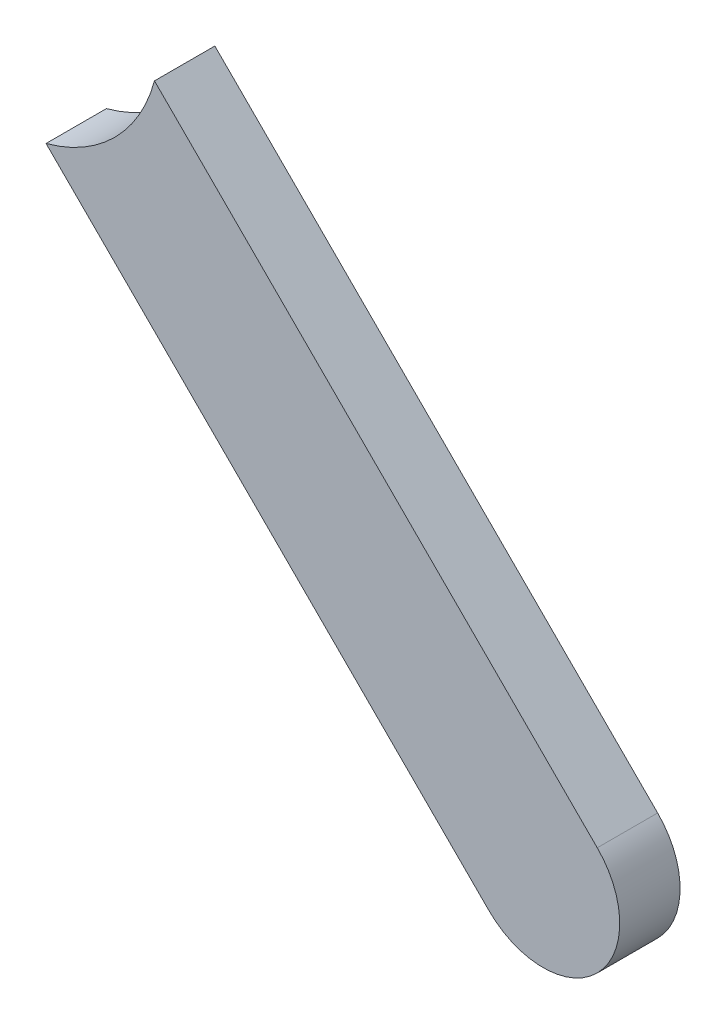
ISO-10303-21;
HEADER;
FILE_DESCRIPTION(('STEP AP214'),'2;1');
FILE_NAME('part.step','',(''),(''),'','','');
FILE_SCHEMA(('AUTOMOTIVE_DESIGN { 1 0 10303 214 1 1 1 1 }'));
ENDSEC;
DATA;
#1=APPLICATION_CONTEXT('core data for automotive mechanical design processes');
#2=APPLICATION_PROTOCOL_DEFINITION('international standard','automotive_design',2000,#1);
#3=PRODUCT_CONTEXT('',#1,'mechanical');
#4=PRODUCT('Part','Part','',(#3));
#5=PRODUCT_RELATED_PRODUCT_CATEGORY('part','',(#4));
#6=PRODUCT_DEFINITION_FORMATION('','',#4);
#7=PRODUCT_DEFINITION_CONTEXT('part definition',#1,'design');
#8=PRODUCT_DEFINITION('design','',#6,#7);
#9=PRODUCT_DEFINITION_SHAPE('','',#8);
#10=(LENGTH_UNIT() NAMED_UNIT(*) SI_UNIT(.MILLI.,.METRE.));
#11=(NAMED_UNIT(*) PLANE_ANGLE_UNIT() SI_UNIT($,.RADIAN.));
#12=(NAMED_UNIT(*) SI_UNIT($,.STERADIAN.) SOLID_ANGLE_UNIT());
#13=UNCERTAINTY_MEASURE_WITH_UNIT(LENGTH_MEASURE(1.E-05),#10,'distance_accuracy_value','');
#14=(GEOMETRIC_REPRESENTATION_CONTEXT(3) GLOBAL_UNCERTAINTY_ASSIGNED_CONTEXT((#13)) GLOBAL_UNIT_ASSIGNED_CONTEXT((#10,
#11,#12)) REPRESENTATION_CONTEXT('',''));
#15=CARTESIAN_POINT('',(0.,0.,0.));
#16=DIRECTION('',(0.,0.,1.));
#17=DIRECTION('',(1.,0.,0.));
#18=AXIS2_PLACEMENT_3D('',#15,#16,#17);
#19=CARTESIAN_POINT('',(152.912480788539,117.492309871461,0.));
#20=DIRECTION('',(0.707106781186548,0.707106781186548,0.));
#21=DIRECTION('',(0.707106781186548,-0.707106781186548,0.));
#22=AXIS2_PLACEMENT_3D('',#19,#20,#21);
#23=PLANE('',#22);
#24=DIRECTION('',(0.707106781186548,-0.707106781186548,0.));
#25=VECTOR('',#24,1.);
#26=CARTESIAN_POINT('',(152.60139406,117.8033966,0.1999996));
#27=LINE('',#26,#25);
#28=CARTESIAN_POINT('',(152.912480788539,117.492309871461,0.1999996));
#29=VERTEX_POINT('',#28);
#30=CARTESIAN_POINT('',(154.3793966,116.02539406,0.1999996));
#31=VERTEX_POINT('',#30);
#32=EDGE_CURVE('E11',#29,#31,#27,.T.);
#33=ORIENTED_EDGE('',*,*,#32,.F.);
#34=DIRECTION('',(0.,0.,1.));
#35=VECTOR('',#34,1.);
#36=CARTESIAN_POINT('',(152.912480788539,117.492309871461,0.));
#37=LINE('',#36,#35);
#38=CARTESIAN_POINT('',(152.912480788539,117.492309871461,0.));
#39=VERTEX_POINT('',#38);
#40=EDGE_CURVE('E24',#39,#29,#37,.T.);
#41=ORIENTED_EDGE('',*,*,#40,.F.);
#42=DIRECTION('',(0.707106781186548,-0.707106781186548,0.));
#43=VECTOR('',#42,1.);
#44=CARTESIAN_POINT('',(152.60139406,117.8033966,0.));
#45=LINE('',#44,#43);
#46=CARTESIAN_POINT('',(154.3793966,116.02539406,0.));
#47=VERTEX_POINT('',#46);
#48=EDGE_CURVE('E75',#39,#47,#45,.T.);
#49=ORIENTED_EDGE('',*,*,#48,.T.);
#50=DIRECTION('',(0.,0.,1.));
#51=VECTOR('',#50,1.);
#52=CARTESIAN_POINT('',(154.3793966,116.02539406,0.));
#53=LINE('',#52,#51);
#54=EDGE_CURVE('E37',#47,#31,#53,.T.);
#55=ORIENTED_EDGE('',*,*,#54,.T.);
#56=EDGE_LOOP('',(#33,#41,#49,#55));
#57=FACE_BOUND('',#56,.T.);
#58=ADVANCED_FACE('F17',(#57),#23,.F.);
#59=CARTESIAN_POINT('',(154.55900127,116.20499873,0.));
#60=DIRECTION('',(0.,0.,-1.));
#61=DIRECTION('',(-0.70710678118652,-0.707106781186576,0.));
#62=AXIS2_PLACEMENT_3D('',#59,#60,#61);
#63=CYLINDRICAL_SURFACE('',#62,0.253999360179542);
#64=CARTESIAN_POINT('',(154.55900127,116.20499873,0.1999996));
#65=DIRECTION('',(0.,0.,1.));
#66=DIRECTION('',(-0.70710678118652,-0.707106781186576,0.));
#67=AXIS2_PLACEMENT_3D('',#64,#65,#66);
#68=CIRCLE('',#67,0.253999360179542);
#69=CARTESIAN_POINT('',(154.73860594,116.3846034,0.1999996));
#70=VERTEX_POINT('',#69);
#71=EDGE_CURVE('E83',#31,#70,#68,.T.);
#72=ORIENTED_EDGE('',*,*,#71,.F.);
#73=ORIENTED_EDGE('',*,*,#54,.F.);
#74=CARTESIAN_POINT('',(154.55900127,116.20499873,0.));
#75=DIRECTION('',(0.,0.,1.));
#76=DIRECTION('',(-0.70710678118652,-0.707106781186576,0.));
#77=AXIS2_PLACEMENT_3D('',#74,#75,#76);
#78=CIRCLE('',#77,0.253999360179542);
#79=CARTESIAN_POINT('',(154.73860594,116.3846034,0.));
#80=VERTEX_POINT('',#79);
#81=EDGE_CURVE('E81',#47,#80,#78,.T.);
#82=ORIENTED_EDGE('',*,*,#81,.T.);
#83=DIRECTION('',(0.,0.,1.));
#84=VECTOR('',#83,1.);
#85=CARTESIAN_POINT('',(154.73860594,116.3846034,0.));
#86=LINE('',#85,#84);
#87=EDGE_CURVE('E67',#80,#70,#86,.T.);
#88=ORIENTED_EDGE('',*,*,#87,.T.);
#89=EDGE_LOOP('',(#72,#73,#82,#88));
#90=FACE_BOUND('',#89,.T.);
#91=ADVANCED_FACE('F89',(#90),#63,.T.);
#92=CARTESIAN_POINT('',(154.73860594,116.3846034,0.));
#93=DIRECTION('',(-0.707106781186548,-0.707106781186548,0.));
#94=DIRECTION('',(-0.707106781186548,0.707106781186548,0.));
#95=AXIS2_PLACEMENT_3D('',#92,#93,#94);
#96=PLANE('',#95);
#97=DIRECTION('',(-0.707106781186548,0.707106781186548,0.));
#98=VECTOR('',#97,1.);
#99=CARTESIAN_POINT('',(154.73860594,116.3846034,0.1999996));
#100=LINE('',#99,#98);
#101=CARTESIAN_POINT('',(153.271690128539,117.851519211461,0.1999996));
#102=VERTEX_POINT('',#101);
#103=EDGE_CURVE('E71',#70,#102,#100,.T.);
#104=ORIENTED_EDGE('',*,*,#103,.F.);
#105=ORIENTED_EDGE('',*,*,#87,.F.);
#106=DIRECTION('',(-0.707106781186548,0.707106781186548,0.));
#107=VECTOR('',#106,1.);
#108=CARTESIAN_POINT('',(154.73860594,116.3846034,0.));
#109=LINE('',#108,#107);
#110=CARTESIAN_POINT('',(153.271690128539,117.851519211461,0.));
#111=VERTEX_POINT('',#110);
#112=EDGE_CURVE('E63',#80,#111,#109,.T.);
#113=ORIENTED_EDGE('',*,*,#112,.T.);
#114=DIRECTION('',(0.,0.,1.));
#115=VECTOR('',#114,1.);
#116=CARTESIAN_POINT('',(153.271690128539,117.851519211461,0.));
#117=LINE('',#116,#115);
#118=EDGE_CURVE('E53',#111,#102,#117,.T.);
#119=ORIENTED_EDGE('',*,*,#118,.T.);
#120=EDGE_LOOP('',(#104,#105,#113,#119));
#121=FACE_BOUND('',#120,.T.);
#122=ADVANCED_FACE('F66',(#121),#96,.F.);
#123=CARTESIAN_POINT('',(152.781,117.983,0.));
#124=DIRECTION('',(0.,0.,-1.));
#125=DIRECTION('',(1.,0.,0.));
#126=AXIS2_PLACEMENT_3D('',#123,#124,#125);
#127=CYLINDRICAL_SURFACE('',#126,0.508);
#128=ORIENTED_EDGE('',*,*,#40,.T.);
#129=CARTESIAN_POINT('',(152.781,117.983,0.1999996));
#130=DIRECTION('',(0.,0.,1.));
#131=DIRECTION('',(1.,0.,0.));
#132=AXIS2_PLACEMENT_3D('',#129,#130,#131);
#133=CIRCLE('',#132,0.508);
#134=EDGE_CURVE('E59',#29,#102,#133,.T.);
#135=ORIENTED_EDGE('',*,*,#134,.T.);
#136=ORIENTED_EDGE('',*,*,#118,.F.);
#137=CARTESIAN_POINT('',(152.781,117.983,0.));
#138=DIRECTION('',(0.,0.,1.));
#139=DIRECTION('',(1.,0.,0.));
#140=AXIS2_PLACEMENT_3D('',#137,#138,#139);
#141=CIRCLE('',#140,0.508);
#142=EDGE_CURVE('E57',#39,#111,#141,.T.);
#143=ORIENTED_EDGE('',*,*,#142,.F.);
#144=EDGE_LOOP('',(#128,#135,#136,#143));
#145=FACE_BOUND('',#144,.T.);
#146=ADVANCED_FACE('F55',(#145),#127,.F.);
#147=CARTESIAN_POINT('',(152.60139406,117.8033966,0.));
#148=DIRECTION('',(0.,0.,-1.));
#149=DIRECTION('',(-1.,0.,0.));
#150=AXIS2_PLACEMENT_3D('',#147,#148,#149);
#151=PLANE('',#150);
#152=ORIENTED_EDGE('',*,*,#48,.F.);
#153=ORIENTED_EDGE('',*,*,#142,.T.);
#154=ORIENTED_EDGE('',*,*,#112,.F.);
#155=ORIENTED_EDGE('',*,*,#81,.F.);
#156=EDGE_LOOP('',(#152,#153,#154,#155));
#157=FACE_BOUND('',#156,.T.);
#158=ADVANCED_FACE('F74',(#157),#151,.T.);
#159=CARTESIAN_POINT('',(152.60139406,117.8033966,0.1999996));
#160=DIRECTION('',(0.,0.,-1.));
#161=DIRECTION('',(-1.,0.,0.));
#162=AXIS2_PLACEMENT_3D('',#159,#160,#161);
#163=PLANE('',#162);
#164=ORIENTED_EDGE('',*,*,#134,.F.);
#165=ORIENTED_EDGE('',*,*,#32,.T.);
#166=ORIENTED_EDGE('',*,*,#71,.T.);
#167=ORIENTED_EDGE('',*,*,#103,.T.);
#168=EDGE_LOOP('',(#164,#165,#166,#167));
#169=FACE_BOUND('',#168,.T.);
#170=ADVANCED_FACE('F91',(#169),#163,.F.);
#171=CLOSED_SHELL('',(#58,#91,#122,#146,#158,#170));
#172=MANIFOLD_SOLID_BREP('B1',#171);
#173=ADVANCED_BREP_SHAPE_REPRESENTATION('',(#18,#172),#14);
#174=SHAPE_DEFINITION_REPRESENTATION(#9,#173);
ENDSEC;
END-ISO-10303-21;
